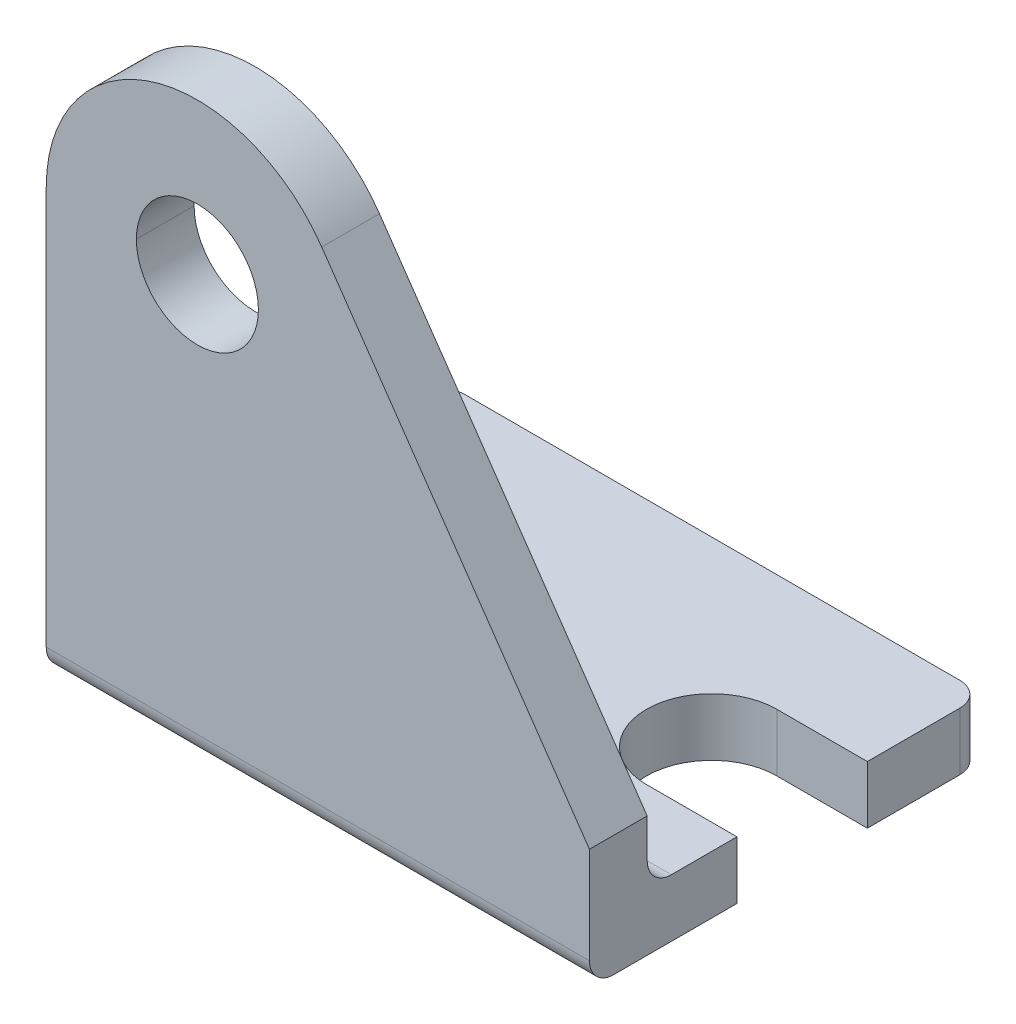
ISO-10303-21;
HEADER;
FILE_DESCRIPTION(('STEP AP214'),'2;1');
FILE_NAME('part.step','',(''),(''),'','','');
FILE_SCHEMA(('AUTOMOTIVE_DESIGN { 1 0 10303 214 1 1 1 1 }'));
ENDSEC;
DATA;
#1=APPLICATION_CONTEXT('core data for automotive mechanical design processes');
#2=APPLICATION_PROTOCOL_DEFINITION('international standard','automotive_design',2000,#1);
#3=PRODUCT_CONTEXT('',#1,'mechanical');
#4=PRODUCT('Part','Part','',(#3));
#5=PRODUCT_RELATED_PRODUCT_CATEGORY('part','',(#4));
#6=PRODUCT_DEFINITION_FORMATION('','',#4);
#7=PRODUCT_DEFINITION_CONTEXT('part definition',#1,'design');
#8=PRODUCT_DEFINITION('design','',#6,#7);
#9=PRODUCT_DEFINITION_SHAPE('','',#8);
#10=(LENGTH_UNIT() NAMED_UNIT(*) SI_UNIT(.MILLI.,.METRE.));
#11=(NAMED_UNIT(*) PLANE_ANGLE_UNIT() SI_UNIT($,.RADIAN.));
#12=(NAMED_UNIT(*) SI_UNIT($,.STERADIAN.) SOLID_ANGLE_UNIT());
#13=UNCERTAINTY_MEASURE_WITH_UNIT(LENGTH_MEASURE(1.E-05),#10,'distance_accuracy_value','');
#14=(GEOMETRIC_REPRESENTATION_CONTEXT(3) GLOBAL_UNCERTAINTY_ASSIGNED_CONTEXT((#13)) GLOBAL_UNIT_ASSIGNED_CONTEXT((#10,
#11,#12)) REPRESENTATION_CONTEXT('',''));
#15=CARTESIAN_POINT('',(0.,0.,0.));
#16=DIRECTION('',(0.,0.,1.));
#17=DIRECTION('',(1.,0.,0.));
#18=AXIS2_PLACEMENT_3D('',#15,#16,#17);
#19=CARTESIAN_POINT('',(4.7625,3.03784,-14.6177));
#20=DIRECTION('',(0.,0.,1.));
#21=DIRECTION('',(1.,0.,0.));
#22=AXIS2_PLACEMENT_3D('',#19,#20,#21);
#23=PLANE('',#22);
#24=DIRECTION('',(-1.,0.,0.));
#25=VECTOR('',#24,1.);
#26=CARTESIAN_POINT('',(4.7625,0.,-14.6177));
#27=LINE('',#26,#25);
#28=CARTESIAN_POINT('',(4.7625,0.,-14.6177));
#29=VERTEX_POINT('',#28);
#30=CARTESIAN_POINT('',(0.,0.,-14.6177));
#31=VERTEX_POINT('',#30);
#32=EDGE_CURVE('E11',#29,#31,#27,.T.);
#33=ORIENTED_EDGE('',*,*,#32,.F.);
#34=DIRECTION('',(0.,-1.,0.));
#35=VECTOR('',#34,1.);
#36=CARTESIAN_POINT('',(4.7625,3.03784,-14.6177));
#37=LINE('',#36,#35);
#38=CARTESIAN_POINT('',(4.7625,3.03784,-14.6177));
#39=VERTEX_POINT('',#38);
#40=EDGE_CURVE('E25',#39,#29,#37,.T.);
#41=ORIENTED_EDGE('',*,*,#40,.F.);
#42=DIRECTION('',(-1.,0.,0.));
#43=VECTOR('',#42,1.);
#44=CARTESIAN_POINT('',(4.7625,3.03784,-14.6177));
#45=LINE('',#44,#43);
#46=CARTESIAN_POINT('',(0.,3.03784,-14.6177));
#47=VERTEX_POINT('',#46);
#48=EDGE_CURVE('E432',#39,#47,#45,.T.);
#49=ORIENTED_EDGE('',*,*,#48,.T.);
#50=DIRECTION('',(0.,-1.,0.));
#51=VECTOR('',#50,1.);
#52=CARTESIAN_POINT('',(0.,3.03784,-14.6177));
#53=LINE('',#52,#51);
#54=EDGE_CURVE('E428',#47,#31,#53,.T.);
#55=ORIENTED_EDGE('',*,*,#54,.T.);
#56=EDGE_LOOP('',(#33,#41,#49,#55));
#57=FACE_BOUND('',#56,.T.);
#58=ADVANCED_FACE('F17',(#57),#23,.T.);
#59=CARTESIAN_POINT('',(0.,1.27000000000001,-1.27));
#60=DIRECTION('',(1.,0.,0.));
#61=DIRECTION('',(0.,0.,-1.));
#62=AXIS2_PLACEMENT_3D('',#59,#60,#61);
#63=PLANE('',#62);
#64=DIRECTION('',(0.,-1.,0.));
#65=VECTOR('',#64,1.);
#66=CARTESIAN_POINT('',(0.,3.03784,-19.4818));
#67=LINE('',#66,#65);
#68=CARTESIAN_POINT('',(0.,3.03784,-19.4818));
#69=VERTEX_POINT('',#68);
#70=CARTESIAN_POINT('',(0.,0.,-19.4818));
#71=VERTEX_POINT('',#70);
#72=EDGE_CURVE('E424',#69,#71,#67,.T.);
#73=ORIENTED_EDGE('',*,*,#72,.T.);
#74=DIRECTION('',(0.,0.,-1.));
#75=VECTOR('',#74,1.);
#76=CARTESIAN_POINT('',(0.,0.,-1.27));
#77=LINE('',#76,#75);
#78=EDGE_CURVE('E419',#31,#71,#77,.T.);
#79=ORIENTED_EDGE('',*,*,#78,.F.);
#80=ORIENTED_EDGE('',*,*,#54,.F.);
#81=DIRECTION('',(0.,0.,1.));
#82=VECTOR('',#81,1.);
#83=CARTESIAN_POINT('',(0.,3.03784,-20.7518));
#84=LINE('',#83,#82);
#85=EDGE_CURVE('E414',#69,#47,#84,.T.);
#86=ORIENTED_EDGE('',*,*,#85,.F.);
#87=EDGE_LOOP('',(#73,#79,#80,#86));
#88=FACE_BOUND('',#87,.T.);
#89=ADVANCED_FACE('F450',(#88),#63,.F.);
#90=CARTESIAN_POINT('',(28.575,3.03784,-20.7518));
#91=DIRECTION('',(0.,-1.,0.));
#92=DIRECTION('',(0.,0.,-1.));
#93=AXIS2_PLACEMENT_3D('',#90,#91,#92);
#94=PLANE('',#93);
#95=DIRECTION('',(-1.,0.,0.));
#96=VECTOR('',#95,1.);
#97=CARTESIAN_POINT('',(28.575,3.03784,-20.7518));
#98=LINE('',#97,#96);
#99=CARTESIAN_POINT('',(27.305,3.03784,-20.7518));
#100=VERTEX_POINT('',#99);
#101=CARTESIAN_POINT('',(1.26999999999985,3.03784,-20.7518));
#102=VERTEX_POINT('',#101);
#103=EDGE_CURVE('E410',#100,#102,#98,.T.);
#104=ORIENTED_EDGE('',*,*,#103,.T.);
#105=CARTESIAN_POINT('',(1.26999999999985,3.03784,-19.4818000000002));
#106=DIRECTION('',(0.,1.,0.));
#107=DIRECTION('',(1.,0.,0.));
#108=AXIS2_PLACEMENT_3D('',#105,#106,#107);
#109=CIRCLE('',#108,1.27);
#110=EDGE_CURVE('E405',#102,#69,#109,.T.);
#111=ORIENTED_EDGE('',*,*,#110,.T.);
#112=ORIENTED_EDGE('',*,*,#85,.T.);
#113=ORIENTED_EDGE('',*,*,#48,.F.);
#114=CARTESIAN_POINT('',(4.7625,3.03784,-11.1887));
#115=DIRECTION('',(0.,1.,0.));
#116=DIRECTION('',(1.,0.,0.));
#117=AXIS2_PLACEMENT_3D('',#114,#115,#116);
#118=CIRCLE('',#117,3.429);
#119=CARTESIAN_POINT('',(4.7625,3.03784,-7.7597));
#120=VERTEX_POINT('',#119);
#121=EDGE_CURVE('E400',#120,#39,#118,.T.);
#122=ORIENTED_EDGE('',*,*,#121,.F.);
#123=DIRECTION('',(1.,0.,0.));
#124=VECTOR('',#123,1.);
#125=CARTESIAN_POINT('',(0.,3.03784,-7.7597));
#126=LINE('',#125,#124);
#127=CARTESIAN_POINT('',(0.,3.03784,-7.7597));
#128=VERTEX_POINT('',#127);
#129=EDGE_CURVE('E395',#128,#120,#126,.T.);
#130=ORIENTED_EDGE('',*,*,#129,.F.);
#131=DIRECTION('',(0.,0.,1.));
#132=VECTOR('',#131,1.);
#133=CARTESIAN_POINT('',(0.,3.03784,-20.7518));
#134=LINE('',#133,#132);
#135=CARTESIAN_POINT('',(0.,3.03784,-4.30784));
#136=VERTEX_POINT('',#135);
#137=EDGE_CURVE('E391',#128,#136,#134,.T.);
#138=ORIENTED_EDGE('',*,*,#137,.T.);
#139=DIRECTION('',(-1.,0.,0.));
#140=VECTOR('',#139,1.);
#141=CARTESIAN_POINT('',(28.575,3.03784,-4.30784));
#142=LINE('',#141,#140);
#143=CARTESIAN_POINT('',(28.575,3.03784,-4.30784));
#144=VERTEX_POINT('',#143);
#145=EDGE_CURVE('E386',#144,#136,#142,.T.);
#146=ORIENTED_EDGE('',*,*,#145,.F.);
#147=DIRECTION('',(0.,0.,1.));
#148=VECTOR('',#147,1.);
#149=CARTESIAN_POINT('',(28.575,3.03784,-20.7518));
#150=LINE('',#149,#148);
#151=CARTESIAN_POINT('',(28.575,3.03784,-7.7597));
#152=VERTEX_POINT('',#151);
#153=EDGE_CURVE('E381',#152,#144,#150,.T.);
#154=ORIENTED_EDGE('',*,*,#153,.F.);
#155=DIRECTION('',(1.,0.,0.));
#156=VECTOR('',#155,1.);
#157=CARTESIAN_POINT('',(23.8125,3.03784,-7.7597));
#158=LINE('',#157,#156);
#159=CARTESIAN_POINT('',(23.8125,3.03784,-7.7597));
#160=VERTEX_POINT('',#159);
#161=EDGE_CURVE('E376',#160,#152,#158,.T.);
#162=ORIENTED_EDGE('',*,*,#161,.F.);
#163=CARTESIAN_POINT('',(23.8125,3.03784,-11.1887));
#164=DIRECTION('',(0.,1.,0.));
#165=DIRECTION('',(1.,0.,0.));
#166=AXIS2_PLACEMENT_3D('',#163,#164,#165);
#167=CIRCLE('',#166,3.429);
#168=CARTESIAN_POINT('',(23.8125,3.03784,-14.6177));
#169=VERTEX_POINT('',#168);
#170=EDGE_CURVE('E371',#169,#160,#167,.T.);
#171=ORIENTED_EDGE('',*,*,#170,.F.);
#172=DIRECTION('',(-1.,0.,0.));
#173=VECTOR('',#172,1.);
#174=CARTESIAN_POINT('',(28.575,3.03784,-14.6177));
#175=LINE('',#174,#173);
#176=CARTESIAN_POINT('',(28.575,3.03784,-14.6177));
#177=VERTEX_POINT('',#176);
#178=EDGE_CURVE('E366',#177,#169,#175,.T.);
#179=ORIENTED_EDGE('',*,*,#178,.F.);
#180=DIRECTION('',(0.,0.,1.));
#181=VECTOR('',#180,1.);
#182=CARTESIAN_POINT('',(28.575,3.03784,-20.7518));
#183=LINE('',#182,#181);
#184=CARTESIAN_POINT('',(28.575,3.03784,-19.4818));
#185=VERTEX_POINT('',#184);
#186=EDGE_CURVE('E361',#185,#177,#183,.T.);
#187=ORIENTED_EDGE('',*,*,#186,.F.);
#188=CARTESIAN_POINT('',(27.3050000000003,3.03784,-19.4818000000003));
#189=DIRECTION('',(0.,1.,0.));
#190=DIRECTION('',(1.,0.,0.));
#191=AXIS2_PLACEMENT_3D('',#188,#189,#190);
#192=CIRCLE('',#191,1.27);
#193=EDGE_CURVE('E357',#185,#100,#192,.T.);
#194=ORIENTED_EDGE('',*,*,#193,.T.);
#195=EDGE_LOOP('',(#104,#111,#112,#113,#122,#130,#138,#146,#154,#162,#171,#179,#187,#194));
#196=FACE_BOUND('',#195,.T.);
#197=ADVANCED_FACE('F445',(#196),#94,.F.);
#198=CARTESIAN_POINT('',(27.3050000000003,3.03784,-19.4818000000003));
#199=DIRECTION('',(0.,1.,0.));
#200=DIRECTION('',(-0.707106781186561,0.,0.707106781186534));
#201=AXIS2_PLACEMENT_3D('',#198,#199,#200);
#202=CYLINDRICAL_SURFACE('',#201,1.27);
#203=CARTESIAN_POINT('',(27.3050000000003,0.,-19.4818000000003));
#204=DIRECTION('',(0.,1.,0.));
#205=DIRECTION('',(1.,0.,0.));
#206=AXIS2_PLACEMENT_3D('',#203,#204,#205);
#207=CIRCLE('',#206,1.27);
#208=CARTESIAN_POINT('',(28.575,0.,-19.4818));
#209=VERTEX_POINT('',#208);
#210=CARTESIAN_POINT('',(27.3050000000003,0.,-20.7518));
#211=VERTEX_POINT('',#210);
#212=EDGE_CURVE('E353',#209,#211,#207,.T.);
#213=ORIENTED_EDGE('',*,*,#212,.T.);
#214=DIRECTION('',(0.,-1.,0.));
#215=VECTOR('',#214,1.);
#216=CARTESIAN_POINT('',(27.305,3.03784,-20.7518));
#217=LINE('',#216,#215);
#218=EDGE_CURVE('E348',#100,#211,#217,.T.);
#219=ORIENTED_EDGE('',*,*,#218,.F.);
#220=ORIENTED_EDGE('',*,*,#193,.F.);
#221=DIRECTION('',(0.,-1.,0.));
#222=VECTOR('',#221,1.);
#223=CARTESIAN_POINT('',(28.575,3.03784,-19.4818));
#224=LINE('',#223,#222);
#225=EDGE_CURVE('E344',#185,#209,#224,.T.);
#226=ORIENTED_EDGE('',*,*,#225,.T.);
#227=EDGE_LOOP('',(#213,#219,#220,#226));
#228=FACE_BOUND('',#227,.T.);
#229=ADVANCED_FACE('F488',(#228),#202,.T.);
#230=CARTESIAN_POINT('',(28.575,1.27000000000001,-1.27));
#231=DIRECTION('',(1.,0.,0.));
#232=DIRECTION('',(0.,0.,-1.));
#233=AXIS2_PLACEMENT_3D('',#230,#231,#232);
#234=PLANE('',#233);
#235=DIRECTION('',(0.,0.,-1.));
#236=VECTOR('',#235,1.);
#237=CARTESIAN_POINT('',(28.575,0.,-1.27));
#238=LINE('',#237,#236);
#239=CARTESIAN_POINT('',(28.575,0.,-14.6177));
#240=VERTEX_POINT('',#239);
#241=EDGE_CURVE('E339',#240,#209,#238,.T.);
#242=ORIENTED_EDGE('',*,*,#241,.T.);
#243=ORIENTED_EDGE('',*,*,#225,.F.);
#244=ORIENTED_EDGE('',*,*,#186,.T.);
#245=DIRECTION('',(0.,-1.,0.));
#246=VECTOR('',#245,1.);
#247=CARTESIAN_POINT('',(28.575,3.03784,-14.6177));
#248=LINE('',#247,#246);
#249=EDGE_CURVE('E335',#177,#240,#248,.T.);
#250=ORIENTED_EDGE('',*,*,#249,.T.);
#251=EDGE_LOOP('',(#242,#243,#244,#250));
#252=FACE_BOUND('',#251,.T.);
#253=ADVANCED_FACE('F485',(#252),#234,.T.);
#254=CARTESIAN_POINT('',(28.575,3.03784,-14.6177));
#255=DIRECTION('',(0.,0.,1.));
#256=DIRECTION('',(1.,0.,0.));
#257=AXIS2_PLACEMENT_3D('',#254,#255,#256);
#258=PLANE('',#257);
#259=DIRECTION('',(-1.,0.,0.));
#260=VECTOR('',#259,1.);
#261=CARTESIAN_POINT('',(28.575,0.,-14.6177));
#262=LINE('',#261,#260);
#263=CARTESIAN_POINT('',(23.8125,0.,-14.6177));
#264=VERTEX_POINT('',#263);
#265=EDGE_CURVE('E330',#240,#264,#262,.T.);
#266=ORIENTED_EDGE('',*,*,#265,.F.);
#267=ORIENTED_EDGE('',*,*,#249,.F.);
#268=ORIENTED_EDGE('',*,*,#178,.T.);
#269=DIRECTION('',(0.,-1.,0.));
#270=VECTOR('',#269,1.);
#271=CARTESIAN_POINT('',(23.8125,3.03784,-14.6177));
#272=LINE('',#271,#270);
#273=EDGE_CURVE('E326',#169,#264,#272,.T.);
#274=ORIENTED_EDGE('',*,*,#273,.T.);
#275=EDGE_LOOP('',(#266,#267,#268,#274));
#276=FACE_BOUND('',#275,.T.);
#277=ADVANCED_FACE('F479',(#276),#258,.T.);
#278=CARTESIAN_POINT('',(23.8125,3.03784,-11.1887));
#279=DIRECTION('',(0.,1.,0.));
#280=DIRECTION('',(1.,0.,0.));
#281=AXIS2_PLACEMENT_3D('',#278,#279,#280);
#282=CYLINDRICAL_SURFACE('',#281,3.429);
#283=ORIENTED_EDGE('',*,*,#273,.F.);
#284=ORIENTED_EDGE('',*,*,#170,.T.);
#285=DIRECTION('',(0.,-1.,0.));
#286=VECTOR('',#285,1.);
#287=CARTESIAN_POINT('',(23.8125,3.03784,-7.7597));
#288=LINE('',#287,#286);
#289=CARTESIAN_POINT('',(23.8125,0.,-7.7597));
#290=VERTEX_POINT('',#289);
#291=EDGE_CURVE('E322',#160,#290,#288,.T.);
#292=ORIENTED_EDGE('',*,*,#291,.T.);
#293=CARTESIAN_POINT('',(23.8125,0.,-11.1887));
#294=DIRECTION('',(0.,1.,0.));
#295=DIRECTION('',(1.,0.,0.));
#296=AXIS2_PLACEMENT_3D('',#293,#294,#295);
#297=CIRCLE('',#296,3.429);
#298=EDGE_CURVE('E317',#264,#290,#297,.T.);
#299=ORIENTED_EDGE('',*,*,#298,.F.);
#300=EDGE_LOOP('',(#283,#284,#292,#299));
#301=FACE_BOUND('',#300,.T.);
#302=ADVANCED_FACE('F475',(#301),#282,.F.);
#303=CARTESIAN_POINT('',(28.575,0.,-1.27));
#304=DIRECTION('',(0.,1.,0.));
#305=DIRECTION('',(0.,0.,1.));
#306=AXIS2_PLACEMENT_3D('',#303,#304,#305);
#307=PLANE('',#306);
#308=ORIENTED_EDGE('',*,*,#78,.T.);
#309=CARTESIAN_POINT('',(1.26999999999985,0.,-19.4818000000002));
#310=DIRECTION('',(0.,1.,0.));
#311=DIRECTION('',(1.,0.,0.));
#312=AXIS2_PLACEMENT_3D('',#309,#310,#311);
#313=CIRCLE('',#312,1.27);
#314=CARTESIAN_POINT('',(1.2699999999999,0.,-20.7518));
#315=VERTEX_POINT('',#314);
#316=EDGE_CURVE('E312',#315,#71,#313,.T.);
#317=ORIENTED_EDGE('',*,*,#316,.F.);
#318=DIRECTION('',(-1.,0.,0.));
#319=VECTOR('',#318,1.);
#320=CARTESIAN_POINT('',(28.575,0.,-20.7518));
#321=LINE('',#320,#319);
#322=EDGE_CURVE('E307',#211,#315,#321,.T.);
#323=ORIENTED_EDGE('',*,*,#322,.F.);
#324=ORIENTED_EDGE('',*,*,#212,.F.);
#325=ORIENTED_EDGE('',*,*,#241,.F.);
#326=ORIENTED_EDGE('',*,*,#265,.T.);
#327=ORIENTED_EDGE('',*,*,#298,.T.);
#328=DIRECTION('',(1.,0.,0.));
#329=VECTOR('',#328,1.);
#330=CARTESIAN_POINT('',(23.8125,0.,-7.7597));
#331=LINE('',#330,#329);
#332=CARTESIAN_POINT('',(28.575,0.,-7.7597));
#333=VERTEX_POINT('',#332);
#334=EDGE_CURVE('E303',#290,#333,#331,.T.);
#335=ORIENTED_EDGE('',*,*,#334,.T.);
#336=DIRECTION('',(0.,0.,-1.));
#337=VECTOR('',#336,1.);
#338=CARTESIAN_POINT('',(28.575,0.,-1.27));
#339=LINE('',#338,#337);
#340=CARTESIAN_POINT('',(28.575,0.,-1.27));
#341=VERTEX_POINT('',#340);
#342=EDGE_CURVE('E298',#341,#333,#339,.T.);
#343=ORIENTED_EDGE('',*,*,#342,.F.);
#344=DIRECTION('',(-1.,0.,0.));
#345=VECTOR('',#344,1.);
#346=CARTESIAN_POINT('',(28.575,0.,-1.27));
#347=LINE('',#346,#345);
#348=CARTESIAN_POINT('',(0.,0.,-1.27));
#349=VERTEX_POINT('',#348);
#350=EDGE_CURVE('E294',#341,#349,#347,.T.);
#351=ORIENTED_EDGE('',*,*,#350,.T.);
#352=DIRECTION('',(0.,0.,-1.));
#353=VECTOR('',#352,1.);
#354=CARTESIAN_POINT('',(0.,0.,-1.27));
#355=LINE('',#354,#353);
#356=CARTESIAN_POINT('',(0.,0.,-7.7597));
#357=VERTEX_POINT('',#356);
#358=EDGE_CURVE('E290',#349,#357,#355,.T.);
#359=ORIENTED_EDGE('',*,*,#358,.T.);
#360=DIRECTION('',(1.,0.,0.));
#361=VECTOR('',#360,1.);
#362=CARTESIAN_POINT('',(0.,0.,-7.7597));
#363=LINE('',#362,#361);
#364=CARTESIAN_POINT('',(4.7625,0.,-7.7597));
#365=VERTEX_POINT('',#364);
#366=EDGE_CURVE('E286',#357,#365,#363,.T.);
#367=ORIENTED_EDGE('',*,*,#366,.T.);
#368=CARTESIAN_POINT('',(4.7625,0.,-11.1887));
#369=DIRECTION('',(0.,1.,0.));
#370=DIRECTION('',(1.,0.,0.));
#371=AXIS2_PLACEMENT_3D('',#368,#369,#370);
#372=CIRCLE('',#371,3.429);
#373=EDGE_CURVE('E282',#365,#29,#372,.T.);
#374=ORIENTED_EDGE('',*,*,#373,.T.);
#375=ORIENTED_EDGE('',*,*,#32,.T.);
#376=EDGE_LOOP('',(#308,#317,#323,#324,#325,#326,#327,#335,#343,#351,#359,#367,#374,#375));
#377=FACE_BOUND('',#376,.T.);
#378=ADVANCED_FACE('F453',(#377),#307,.F.);
#379=CARTESIAN_POINT('',(4.7625,3.03784,-11.1887));
#380=DIRECTION('',(0.,1.,0.));
#381=DIRECTION('',(-1.,0.,0.));
#382=AXIS2_PLACEMENT_3D('',#379,#380,#381);
#383=CYLINDRICAL_SURFACE('',#382,3.429);
#384=ORIENTED_EDGE('',*,*,#40,.T.);
#385=ORIENTED_EDGE('',*,*,#373,.F.);
#386=DIRECTION('',(0.,-1.,0.));
#387=VECTOR('',#386,1.);
#388=CARTESIAN_POINT('',(4.7625,3.03784,-7.7597));
#389=LINE('',#388,#387);
#390=EDGE_CURVE('E277',#120,#365,#389,.T.);
#391=ORIENTED_EDGE('',*,*,#390,.F.);
#392=ORIENTED_EDGE('',*,*,#121,.T.);
#393=EDGE_LOOP('',(#384,#385,#391,#392));
#394=FACE_BOUND('',#393,.T.);
#395=ADVANCED_FACE('F442',(#394),#383,.F.);
#396=CARTESIAN_POINT('',(0.,3.03784,-7.7597));
#397=DIRECTION('',(0.,0.,-1.));
#398=DIRECTION('',(-1.,0.,0.));
#399=AXIS2_PLACEMENT_3D('',#396,#397,#398);
#400=PLANE('',#399);
#401=ORIENTED_EDGE('',*,*,#366,.F.);
#402=DIRECTION('',(0.,-1.,0.));
#403=VECTOR('',#402,1.);
#404=CARTESIAN_POINT('',(0.,3.03784,-7.7597));
#405=LINE('',#404,#403);
#406=EDGE_CURVE('E272',#128,#357,#405,.T.);
#407=ORIENTED_EDGE('',*,*,#406,.F.);
#408=ORIENTED_EDGE('',*,*,#129,.T.);
#409=ORIENTED_EDGE('',*,*,#390,.T.);
#410=EDGE_LOOP('',(#401,#407,#408,#409));
#411=FACE_BOUND('',#410,.T.);
#412=ADVANCED_FACE('F457',(#411),#400,.T.);
#413=CARTESIAN_POINT('',(0.,1.27000000000001,-1.27));
#414=DIRECTION('',(1.,0.,0.));
#415=DIRECTION('',(0.,0.,-1.));
#416=AXIS2_PLACEMENT_3D('',#413,#414,#415);
#417=PLANE('',#416);
#418=ORIENTED_EDGE('',*,*,#406,.T.);
#419=ORIENTED_EDGE('',*,*,#358,.F.);
#420=CARTESIAN_POINT('',(0.,1.27000000000001,-1.27));
#421=DIRECTION('',(1.,0.,0.));
#422=DIRECTION('',(0.,0.,-1.));
#423=AXIS2_PLACEMENT_3D('',#420,#421,#422);
#424=CIRCLE('',#423,1.27);
#425=CARTESIAN_POINT('',(0.,1.27,0.));
#426=VERTEX_POINT('',#425);
#427=EDGE_CURVE('E267',#426,#349,#424,.T.);
#428=ORIENTED_EDGE('',*,*,#427,.F.);
#429=DIRECTION('',(0.,-1.,0.));
#430=VECTOR('',#429,1.);
#431=CARTESIAN_POINT('',(0.,30.226,0.));
#432=LINE('',#431,#430);
#433=CARTESIAN_POINT('',(0.,22.225,0.));
#434=VERTEX_POINT('',#433);
#435=EDGE_CURVE('E262',#434,#426,#432,.T.);
#436=ORIENTED_EDGE('',*,*,#435,.F.);
#437=DIRECTION('',(0.,0.,1.));
#438=VECTOR('',#437,1.);
#439=CARTESIAN_POINT('',(0.,22.225,-20.7518));
#440=LINE('',#439,#438);
#441=CARTESIAN_POINT('',(0.,22.2250000000004,-3.03784));
#442=VERTEX_POINT('',#441);
#443=EDGE_CURVE('E257',#442,#434,#440,.T.);
#444=ORIENTED_EDGE('',*,*,#443,.F.);
#445=DIRECTION('',(0.,1.,0.));
#446=VECTOR('',#445,1.);
#447=CARTESIAN_POINT('',(0.,4.30784,-3.03784));
#448=LINE('',#447,#446);
#449=CARTESIAN_POINT('',(0.,4.30784,-3.03784));
#450=VERTEX_POINT('',#449);
#451=EDGE_CURVE('E252',#450,#442,#448,.T.);
#452=ORIENTED_EDGE('',*,*,#451,.F.);
#453=CARTESIAN_POINT('',(0.,4.30784000000005,-4.30784000000005));
#454=DIRECTION('',(1.,0.,0.));
#455=DIRECTION('',(0.,0.,-1.));
#456=AXIS2_PLACEMENT_3D('',#453,#454,#455);
#457=CIRCLE('',#456,1.27);
#458=EDGE_CURVE('E247',#450,#136,#457,.T.);
#459=ORIENTED_EDGE('',*,*,#458,.T.);
#460=ORIENTED_EDGE('',*,*,#137,.F.);
#461=EDGE_LOOP('',(#418,#419,#428,#436,#444,#452,#459,#460));
#462=FACE_BOUND('',#461,.T.);
#463=ADVANCED_FACE('F460',(#462),#417,.F.);
#464=CARTESIAN_POINT('',(28.575,4.30784000000005,-4.30784000000005));
#465=DIRECTION('',(1.,0.,0.));
#466=DIRECTION('',(0.,0.707106781186533,-0.707106781186562));
#467=AXIS2_PLACEMENT_3D('',#464,#465,#466);
#468=CYLINDRICAL_SURFACE('',#467,1.27);
#469=ORIENTED_EDGE('',*,*,#145,.T.);
#470=ORIENTED_EDGE('',*,*,#458,.F.);
#471=DIRECTION('',(-1.,0.,0.));
#472=VECTOR('',#471,1.);
#473=CARTESIAN_POINT('',(28.575,4.30784,-3.03784));
#474=LINE('',#473,#472);
#475=CARTESIAN_POINT('',(28.575,4.30784,-3.03784));
#476=VERTEX_POINT('',#475);
#477=EDGE_CURVE('E242',#476,#450,#474,.T.);
#478=ORIENTED_EDGE('',*,*,#477,.F.);
#479=CARTESIAN_POINT('',(28.575,4.30784000000005,-4.30784000000005));
#480=DIRECTION('',(1.,0.,0.));
#481=DIRECTION('',(0.,0.,-1.));
#482=AXIS2_PLACEMENT_3D('',#479,#480,#481);
#483=CIRCLE('',#482,1.27);
#484=EDGE_CURVE('E237',#476,#144,#483,.T.);
#485=ORIENTED_EDGE('',*,*,#484,.T.);
#486=EDGE_LOOP('',(#469,#470,#478,#485));
#487=FACE_BOUND('',#486,.T.);
#488=ADVANCED_FACE('F465',(#487),#468,.F.);
#489=CARTESIAN_POINT('',(28.575,1.27000000000001,-1.27));
#490=DIRECTION('',(1.,0.,0.));
#491=DIRECTION('',(0.,0.,-1.));
#492=AXIS2_PLACEMENT_3D('',#489,#490,#491);
#493=PLANE('',#492);
#494=ORIENTED_EDGE('',*,*,#342,.T.);
#495=DIRECTION('',(0.,-1.,0.));
#496=VECTOR('',#495,1.);
#497=CARTESIAN_POINT('',(28.575,3.03784,-7.7597));
#498=LINE('',#497,#496);
#499=EDGE_CURVE('E232',#152,#333,#498,.T.);
#500=ORIENTED_EDGE('',*,*,#499,.F.);
#501=ORIENTED_EDGE('',*,*,#153,.T.);
#502=ORIENTED_EDGE('',*,*,#484,.F.);
#503=DIRECTION('',(0.,1.,0.));
#504=VECTOR('',#503,1.);
#505=CARTESIAN_POINT('',(28.575,4.30784,-3.03784));
#506=LINE('',#505,#504);
#507=CARTESIAN_POINT('',(28.575,6.35,-3.03784));
#508=VERTEX_POINT('',#507);
#509=EDGE_CURVE('E228',#476,#508,#506,.T.);
#510=ORIENTED_EDGE('',*,*,#509,.T.);
#511=DIRECTION('',(0.,0.,1.));
#512=VECTOR('',#511,1.);
#513=CARTESIAN_POINT('',(28.575,6.35,-20.7518));
#514=LINE('',#513,#512);
#515=CARTESIAN_POINT('',(28.575,6.35,0.));
#516=VERTEX_POINT('',#515);
#517=EDGE_CURVE('E224',#508,#516,#514,.T.);
#518=ORIENTED_EDGE('',*,*,#517,.T.);
#519=DIRECTION('',(0.,-1.,0.));
#520=VECTOR('',#519,1.);
#521=CARTESIAN_POINT('',(28.575,30.226,0.));
#522=LINE('',#521,#520);
#523=CARTESIAN_POINT('',(28.575,1.27,0.));
#524=VERTEX_POINT('',#523);
#525=EDGE_CURVE('E220',#516,#524,#522,.T.);
#526=ORIENTED_EDGE('',*,*,#525,.T.);
#527=CARTESIAN_POINT('',(28.575,1.27000000000001,-1.27));
#528=DIRECTION('',(1.,0.,0.));
#529=DIRECTION('',(0.,0.,-1.));
#530=AXIS2_PLACEMENT_3D('',#527,#528,#529);
#531=CIRCLE('',#530,1.27);
#532=EDGE_CURVE('E215',#524,#341,#531,.T.);
#533=ORIENTED_EDGE('',*,*,#532,.T.);
#534=EDGE_LOOP('',(#494,#500,#501,#502,#510,#518,#526,#533));
#535=FACE_BOUND('',#534,.T.);
#536=ADVANCED_FACE('F468',(#535),#493,.T.);
#537=CARTESIAN_POINT('',(28.575,1.27000000000001,-1.27));
#538=DIRECTION('',(1.,0.,0.));
#539=DIRECTION('',(0.,0.707106781186548,-0.707106781186547));
#540=AXIS2_PLACEMENT_3D('',#537,#538,#539);
#541=CYLINDRICAL_SURFACE('',#540,1.27);
#542=ORIENTED_EDGE('',*,*,#427,.T.);
#543=ORIENTED_EDGE('',*,*,#350,.F.);
#544=ORIENTED_EDGE('',*,*,#532,.F.);
#545=DIRECTION('',(-1.,0.,0.));
#546=VECTOR('',#545,1.);
#547=CARTESIAN_POINT('',(28.575,1.27,0.));
#548=LINE('',#547,#546);
#549=EDGE_CURVE('E210',#524,#426,#548,.T.);
#550=ORIENTED_EDGE('',*,*,#549,.T.);
#551=EDGE_LOOP('',(#542,#543,#544,#550));
#552=FACE_BOUND('',#551,.T.);
#553=ADVANCED_FACE('F505',(#552),#541,.T.);
#554=CARTESIAN_POINT('',(28.575,30.226,0.));
#555=DIRECTION('',(0.,0.,-1.));
#556=DIRECTION('',(-1.,0.,0.));
#557=AXIS2_PLACEMENT_3D('',#554,#555,#556);
#558=PLANE('',#557);
#559=CARTESIAN_POINT('',(7.9502,22.225,0.));
#560=DIRECTION('',(0.,0.,1.));
#561=DIRECTION('',(1.,0.,0.));
#562=AXIS2_PLACEMENT_3D('',#559,#560,#561);
#563=CIRCLE('',#562,3.209925);
#564=CARTESIAN_POINT('',(11.160125,22.225,0.));
#565=VERTEX_POINT('',#564);
#566=CARTESIAN_POINT('',(4.740275,22.225,0.));
#567=VERTEX_POINT('',#566);
#568=EDGE_CURVE('E206',#565,#567,#563,.T.);
#569=ORIENTED_EDGE('',*,*,#568,.F.);
#570=CARTESIAN_POINT('',(7.9502,22.225,0.));
#571=DIRECTION('',(0.,0.,1.));
#572=DIRECTION('',(1.,0.,0.));
#573=AXIS2_PLACEMENT_3D('',#570,#571,#572);
#574=CIRCLE('',#573,3.209925);
#575=EDGE_CURVE('E170',#567,#565,#574,.T.);
#576=ORIENTED_EDGE('',*,*,#575,.F.);
#577=EDGE_LOOP('',(#569,#576));
#578=FACE_BOUND('',#577,.T.);
#579=CARTESIAN_POINT('',(7.9501999999999,22.2250000000004,0.));
#580=DIRECTION('',(0.,0.,1.));
#581=DIRECTION('',(1.,0.,0.));
#582=AXIS2_PLACEMENT_3D('',#579,#580,#581);
#583=CIRCLE('',#582,7.9502);
#584=CARTESIAN_POINT('',(14.492056553932,26.7427198748681,0.));
#585=VERTEX_POINT('',#584);
#586=EDGE_CURVE('E198',#585,#434,#583,.T.);
#587=ORIENTED_EDGE('',*,*,#586,.T.);
#588=ORIENTED_EDGE('',*,*,#435,.T.);
#589=ORIENTED_EDGE('',*,*,#549,.F.);
#590=ORIENTED_EDGE('',*,*,#525,.F.);
#591=DIRECTION('',(-0.568252355270083,0.822854337492368,0.));
#592=VECTOR('',#591,1.);
#593=CARTESIAN_POINT('',(28.575,6.35,0.));
#594=LINE('',#593,#592);
#595=EDGE_CURVE('E194',#516,#585,#594,.T.);
#596=ORIENTED_EDGE('',*,*,#595,.T.);
#597=EDGE_LOOP('',(#587,#588,#589,#590,#596));
#598=FACE_BOUND('',#597,.T.);
#599=ADVANCED_FACE('F508',(#578,#598),#558,.F.);
#600=CARTESIAN_POINT('',(28.575,6.35,-20.7518));
#601=DIRECTION('',(0.822854337492368,0.568252355270083,0.));
#602=DIRECTION('',(-0.568252355270083,0.822854337492368,0.));
#603=AXIS2_PLACEMENT_3D('',#600,#601,#602);
#604=PLANE('',#603);
#605=DIRECTION('',(-0.568252355270083,0.822854337492368,0.));
#606=VECTOR('',#605,1.);
#607=CARTESIAN_POINT('',(29.5298913793186,4.96727539530762,-3.03784));
#608=LINE('',#607,#606);
#609=CARTESIAN_POINT('',(14.492056553932,26.7427198748681,-3.03784));
#610=VERTEX_POINT('',#609);
#611=EDGE_CURVE('E190',#508,#610,#608,.T.);
#612=ORIENTED_EDGE('',*,*,#611,.T.);
#613=DIRECTION('',(0.,0.,1.));
#614=VECTOR('',#613,1.);
#615=CARTESIAN_POINT('',(14.492056553932,26.7427198748681,-20.7518));
#616=LINE('',#615,#614);
#617=EDGE_CURVE('E179',#610,#585,#616,.T.);
#618=ORIENTED_EDGE('',*,*,#617,.T.);
#619=ORIENTED_EDGE('',*,*,#595,.F.);
#620=ORIENTED_EDGE('',*,*,#517,.F.);
#621=EDGE_LOOP('',(#612,#618,#619,#620));
#622=FACE_BOUND('',#621,.T.);
#623=ADVANCED_FACE('F517',(#622),#604,.T.);
#624=CARTESIAN_POINT('',(7.9501999999999,22.2250000000004,-20.7518));
#625=DIRECTION('',(0.,0.,-1.));
#626=DIRECTION('',(0.297611880229618,-0.954686948033852,0.));
#627=AXIS2_PLACEMENT_3D('',#624,#625,#626);
#628=CYLINDRICAL_SURFACE('',#627,7.9502);
#629=CARTESIAN_POINT('',(7.9501999999999,22.2250000000004,-3.03784));
#630=DIRECTION('',(0.,0.,1.));
#631=DIRECTION('',(1.,0.,0.));
#632=AXIS2_PLACEMENT_3D('',#629,#630,#631);
#633=CIRCLE('',#632,7.9502);
#634=EDGE_CURVE('E176',#610,#442,#633,.T.);
#635=ORIENTED_EDGE('',*,*,#634,.T.);
#636=ORIENTED_EDGE('',*,*,#443,.T.);
#637=ORIENTED_EDGE('',*,*,#586,.F.);
#638=ORIENTED_EDGE('',*,*,#617,.F.);
#639=EDGE_LOOP('',(#635,#636,#637,#638));
#640=FACE_BOUND('',#639,.T.);
#641=ADVANCED_FACE('F512',(#640),#628,.T.);
#642=CARTESIAN_POINT('',(28.575,4.30784,-3.03784));
#643=DIRECTION('',(0.,0.,1.));
#644=DIRECTION('',(1.,0.,0.));
#645=AXIS2_PLACEMENT_3D('',#642,#643,#644);
#646=PLANE('',#645);
#647=CARTESIAN_POINT('',(7.9502,22.225,-3.03784));
#648=DIRECTION('',(0.,0.,1.));
#649=DIRECTION('',(1.,0.,0.));
#650=AXIS2_PLACEMENT_3D('',#647,#648,#649);
#651=CIRCLE('',#650,3.209925);
#652=CARTESIAN_POINT('',(11.160125,22.225,-3.03784));
#653=VERTEX_POINT('',#652);
#654=CARTESIAN_POINT('',(4.740275,22.225,-3.03784));
#655=VERTEX_POINT('',#654);
#656=EDGE_CURVE('E160',#653,#655,#651,.T.);
#657=ORIENTED_EDGE('',*,*,#656,.T.);
#658=CARTESIAN_POINT('',(7.9502,22.225,-3.03784));
#659=DIRECTION('',(0.,0.,1.));
#660=DIRECTION('',(1.,0.,0.));
#661=AXIS2_PLACEMENT_3D('',#658,#659,#660);
#662=CIRCLE('',#661,3.209925);
#663=EDGE_CURVE('E155',#655,#653,#662,.T.);
#664=ORIENTED_EDGE('',*,*,#663,.T.);
#665=EDGE_LOOP('',(#657,#664));
#666=FACE_BOUND('',#665,.T.);
#667=ORIENTED_EDGE('',*,*,#634,.F.);
#668=ORIENTED_EDGE('',*,*,#611,.F.);
#669=ORIENTED_EDGE('',*,*,#509,.F.);
#670=ORIENTED_EDGE('',*,*,#477,.T.);
#671=ORIENTED_EDGE('',*,*,#451,.T.);
#672=EDGE_LOOP('',(#667,#668,#669,#670,#671));
#673=FACE_BOUND('',#672,.T.);
#674=ADVANCED_FACE('F157',(#666,#673),#646,.F.);
#675=CARTESIAN_POINT('',(7.9502,22.225,-3.03784));
#676=DIRECTION('',(0.,0.,-1.));
#677=DIRECTION('',(0.,1.,0.));
#678=AXIS2_PLACEMENT_3D('',#675,#676,#677);
#679=CYLINDRICAL_SURFACE('',#678,3.209925);
#680=ORIENTED_EDGE('',*,*,#663,.F.);
#681=DIRECTION('',(0.,0.,-1.));
#682=VECTOR('',#681,1.);
#683=CARTESIAN_POINT('',(4.740275,22.225,0.));
#684=LINE('',#683,#682);
#685=EDGE_CURVE('E164',#567,#655,#684,.T.);
#686=ORIENTED_EDGE('',*,*,#685,.F.);
#687=ORIENTED_EDGE('',*,*,#575,.T.);
#688=DIRECTION('',(0.,0.,-1.));
#689=VECTOR('',#688,1.);
#690=CARTESIAN_POINT('',(11.160125,22.225,0.));
#691=LINE('',#690,#689);
#692=EDGE_CURVE('E168',#565,#653,#691,.T.);
#693=ORIENTED_EDGE('',*,*,#692,.T.);
#694=EDGE_LOOP('',(#680,#686,#687,#693));
#695=FACE_BOUND('',#694,.T.);
#696=ADVANCED_FACE('F169',(#695),#679,.F.);
#697=CARTESIAN_POINT('',(7.9502,22.225,-3.03784));
#698=DIRECTION('',(0.,0.,-1.));
#699=DIRECTION('',(0.,-1.,0.));
#700=AXIS2_PLACEMENT_3D('',#697,#698,#699);
#701=CYLINDRICAL_SURFACE('',#700,3.209925);
#702=ORIENTED_EDGE('',*,*,#568,.T.);
#703=ORIENTED_EDGE('',*,*,#685,.T.);
#704=ORIENTED_EDGE('',*,*,#656,.F.);
#705=ORIENTED_EDGE('',*,*,#692,.F.);
#706=EDGE_LOOP('',(#702,#703,#704,#705));
#707=FACE_BOUND('',#706,.T.);
#708=ADVANCED_FACE('F175',(#707),#701,.F.);
#709=CARTESIAN_POINT('',(23.8125,3.03784,-7.7597));
#710=DIRECTION('',(0.,0.,-1.));
#711=DIRECTION('',(-1.,0.,0.));
#712=AXIS2_PLACEMENT_3D('',#709,#710,#711);
#713=PLANE('',#712);
#714=ORIENTED_EDGE('',*,*,#334,.F.);
#715=ORIENTED_EDGE('',*,*,#291,.F.);
#716=ORIENTED_EDGE('',*,*,#161,.T.);
#717=ORIENTED_EDGE('',*,*,#499,.T.);
#718=EDGE_LOOP('',(#714,#715,#716,#717));
#719=FACE_BOUND('',#718,.T.);
#720=ADVANCED_FACE('F472',(#719),#713,.T.);
#721=CARTESIAN_POINT('',(28.575,0.,-20.7518));
#722=DIRECTION('',(0.,0.,1.));
#723=DIRECTION('',(1.,0.,0.));
#724=AXIS2_PLACEMENT_3D('',#721,#722,#723);
#725=PLANE('',#724);
#726=ORIENTED_EDGE('',*,*,#322,.T.);
#727=DIRECTION('',(0.,-1.,0.));
#728=VECTOR('',#727,1.);
#729=CARTESIAN_POINT('',(1.2699999999999,3.03784,-20.7518));
#730=LINE('',#729,#728);
#731=EDGE_CURVE('E173',#102,#315,#730,.T.);
#732=ORIENTED_EDGE('',*,*,#731,.F.);
#733=ORIENTED_EDGE('',*,*,#103,.F.);
#734=ORIENTED_EDGE('',*,*,#218,.T.);
#735=EDGE_LOOP('',(#726,#732,#733,#734));
#736=FACE_BOUND('',#735,.T.);
#737=ADVANCED_FACE('F496',(#736),#725,.F.);
#738=CARTESIAN_POINT('',(1.26999999999985,3.03784,-19.4818000000002));
#739=DIRECTION('',(0.,1.,0.));
#740=DIRECTION('',(0.707106781186604,0.,0.707106781186491));
#741=AXIS2_PLACEMENT_3D('',#738,#739,#740);
#742=CYLINDRICAL_SURFACE('',#741,1.27);
#743=ORIENTED_EDGE('',*,*,#316,.T.);
#744=ORIENTED_EDGE('',*,*,#72,.F.);
#745=ORIENTED_EDGE('',*,*,#110,.F.);
#746=ORIENTED_EDGE('',*,*,#731,.T.);
#747=EDGE_LOOP('',(#743,#744,#745,#746));
#748=FACE_BOUND('',#747,.T.);
#749=ADVANCED_FACE('F499',(#748),#742,.T.);
#750=CLOSED_SHELL('',(#58,#89,#197,#229,#253,#277,#302,#378,#395,#412,#463,#488,#536,#553,#599,
#623,#641,#674,#696,#708,#720,#737,#749));
#751=MANIFOLD_SOLID_BREP('B1',#750);
#752=ADVANCED_BREP_SHAPE_REPRESENTATION('',(#18,#751),#14);
#753=SHAPE_DEFINITION_REPRESENTATION(#9,#752);
ENDSEC;
END-ISO-10303-21;
